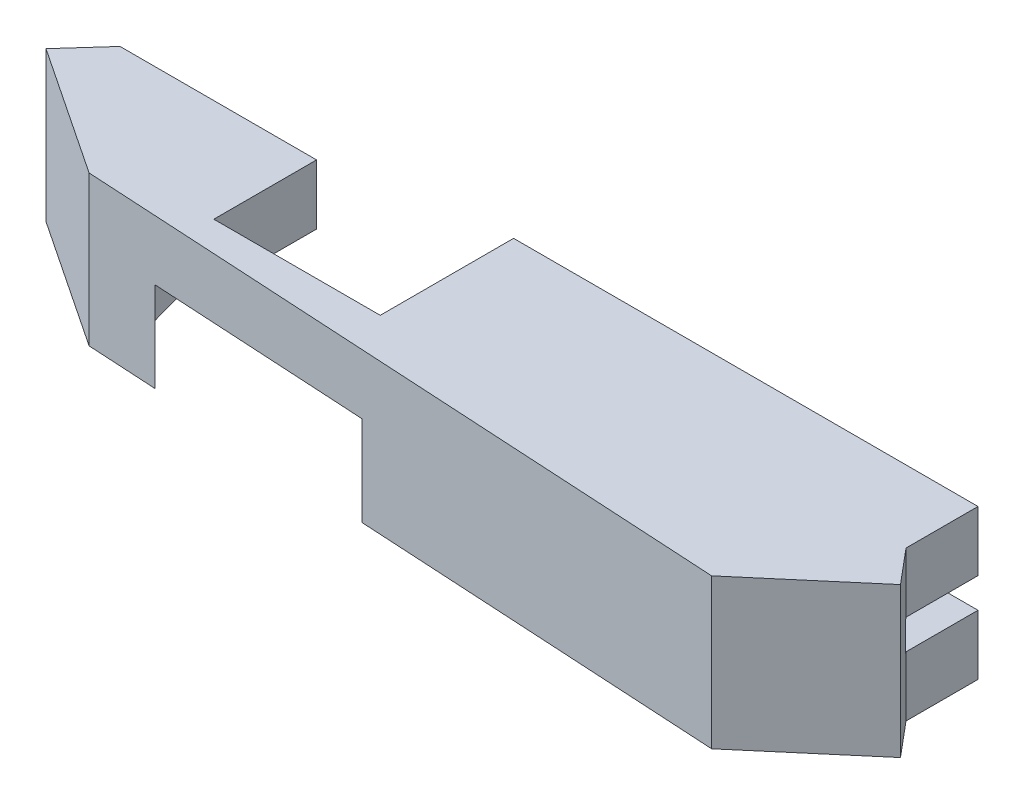
ISO-10303-21;
HEADER;
FILE_DESCRIPTION(('STEP AP214'),'2;1');
FILE_NAME('part.step','',(''),(''),'','','');
FILE_SCHEMA(('AUTOMOTIVE_DESIGN { 1 0 10303 214 1 1 1 1 }'));
ENDSEC;
DATA;
#1=APPLICATION_CONTEXT('core data for automotive mechanical design processes');
#2=APPLICATION_PROTOCOL_DEFINITION('international standard','automotive_design',2000,#1);
#3=PRODUCT_CONTEXT('',#1,'mechanical');
#4=PRODUCT('Part','Part','',(#3));
#5=PRODUCT_RELATED_PRODUCT_CATEGORY('part','',(#4));
#6=PRODUCT_DEFINITION_FORMATION('','',#4);
#7=PRODUCT_DEFINITION_CONTEXT('part definition',#1,'design');
#8=PRODUCT_DEFINITION('design','',#6,#7);
#9=PRODUCT_DEFINITION_SHAPE('','',#8);
#10=(LENGTH_UNIT() NAMED_UNIT(*) SI_UNIT(.MILLI.,.METRE.));
#11=(NAMED_UNIT(*) PLANE_ANGLE_UNIT() SI_UNIT($,.RADIAN.));
#12=(NAMED_UNIT(*) SI_UNIT($,.STERADIAN.) SOLID_ANGLE_UNIT());
#13=UNCERTAINTY_MEASURE_WITH_UNIT(LENGTH_MEASURE(1.E-05),#10,'distance_accuracy_value','');
#14=(GEOMETRIC_REPRESENTATION_CONTEXT(3) GLOBAL_UNCERTAINTY_ASSIGNED_CONTEXT((#13)) GLOBAL_UNIT_ASSIGNED_CONTEXT((#10,
#11,#12)) REPRESENTATION_CONTEXT('',''));
#15=CARTESIAN_POINT('',(0.,0.,0.));
#16=DIRECTION('',(0.,0.,1.));
#17=DIRECTION('',(1.,0.,0.));
#18=AXIS2_PLACEMENT_3D('',#15,#16,#17);
#19=CARTESIAN_POINT('',(0.,-6.,0.));
#20=DIRECTION('',(0.,-1.,0.));
#21=DIRECTION('',(0.,0.,-1.));
#22=AXIS2_PLACEMENT_3D('',#19,#20,#21);
#23=PLANE('',#22);
#24=DIRECTION('',(-0.831488262823537,0.,-0.555542319528131));
#25=VECTOR('',#24,1.);
#26=CARTESIAN_POINT('',(0.212763339109905,-6.,-0.318445981539796));
#27=LINE('',#26,#25);
#28=CARTESIAN_POINT('',(3.31085332593218,-6.,1.75148112908664));
#29=VERTEX_POINT('',#28);
#30=CARTESIAN_POINT('',(0.689386067363199,-6.,0.));
#31=VERTEX_POINT('',#30);
#32=EDGE_CURVE('E269',#29,#31,#27,.T.);
#33=ORIENTED_EDGE('',*,*,#32,.F.);
#34=DIRECTION('',(0.998377105019339,0.,0.0569487152901927));
#35=VECTOR('',#34,1.);
#36=CARTESIAN_POINT('',(-0.0888451107429899,-6.,1.55755795379609));
#37=LINE('',#36,#35);
#38=CARTESIAN_POINT('',(-1.3382612127177,-6.,1.48628965095479));
#39=VERTEX_POINT('',#38);
#40=EDGE_CURVE('E300',#39,#29,#37,.T.);
#41=ORIENTED_EDGE('',*,*,#40,.F.);
#42=DIRECTION('',(0.832202433014696,0.,0.554471920375073));
#43=VECTOR('',#42,1.);
#44=CARTESIAN_POINT('',(-1.09725675273359,-6.,1.64686380989142));
#45=LINE('',#44,#43);
#46=CARTESIAN_POINT('',(-9.95919158339931,-6.,-4.25758182600735));
#47=VERTEX_POINT('',#46);
#48=EDGE_CURVE('E304',#47,#39,#45,.T.);
#49=ORIENTED_EDGE('',*,*,#48,.F.);
#50=DIRECTION('',(-0.669130606358839,0.,0.743144825477412));
#51=VECTOR('',#50,1.);
#52=CARTESIAN_POINT('',(-7.61723446114347,-6.,-6.8585887151781));
#53=LINE('',#52,#51);
#54=CARTESIAN_POINT('',(-7.61723446114333,-6.,-6.85858871517825));
#55=VERTEX_POINT('',#54);
#56=EDGE_CURVE('E308',#55,#47,#53,.T.);
#57=ORIENTED_EDGE('',*,*,#56,.F.);
#58=DIRECTION('',(-1.,0.,0.));
#59=VECTOR('',#58,1.);
#60=CARTESIAN_POINT('',(0.,-6.,-6.85858871517825));
#61=LINE('',#60,#59);
#62=CARTESIAN_POINT('',(-1.90430861528583,-6.,-6.85858871517825));
#63=VERTEX_POINT('',#62);
#64=EDGE_CURVE('E312',#63,#55,#61,.T.);
#65=ORIENTED_EDGE('',*,*,#64,.F.);
#66=DIRECTION('',(-0.26753236006603,0.,-0.963548875935985));
#67=VECTOR('',#66,1.);
#68=CARTESIAN_POINT('',(0.,-6.,0.));
#69=LINE('',#68,#67);
#70=CARTESIAN_POINT('',(0.,-6.,0.));
#71=VERTEX_POINT('',#70);
#72=EDGE_CURVE('E667',#71,#63,#69,.T.);
#73=ORIENTED_EDGE('',*,*,#72,.F.);
#74=DIRECTION('',(1.,0.,0.));
#75=VECTOR('',#74,1.);
#76=CARTESIAN_POINT('',(0.,-6.,0.));
#77=LINE('',#76,#75);
#78=EDGE_CURVE('E276',#71,#31,#77,.T.);
#79=ORIENTED_EDGE('',*,*,#78,.T.);
#80=EDGE_LOOP('',(#33,#41,#49,#57,#65,#73,#79));
#81=FACE_BOUND('',#80,.T.);
#82=ADVANCED_FACE('F44',(#81),#23,.T.);
#83=CARTESIAN_POINT('',(0.,-2.,0.));
#84=DIRECTION('',(0.,-1.,0.));
#85=DIRECTION('',(0.,0.,-1.));
#86=AXIS2_PLACEMENT_3D('',#83,#84,#85);
#87=PLANE('',#86);
#88=DIRECTION('',(1.,0.,0.));
#89=VECTOR('',#88,1.);
#90=CARTESIAN_POINT('',(0.,-2.,0.3));
#91=LINE('',#90,#89);
#92=CARTESIAN_POINT('',(-0.115159210510547,-2.,0.300000000000004));
#93=VERTEX_POINT('',#92);
#94=CARTESIAN_POINT('',(1.13840042698739,-2.,0.3));
#95=VERTEX_POINT('',#94);
#96=EDGE_CURVE('E364',#93,#95,#91,.T.);
#97=ORIENTED_EDGE('',*,*,#96,.T.);
#98=DIRECTION('',(-0.831488262823538,0.,-0.555542319528131));
#99=VECTOR('',#98,1.);
#100=CARTESIAN_POINT('',(0.212763339109905,-2.,-0.318445981539796));
#101=LINE('',#100,#99);
#102=CARTESIAN_POINT('',(0.689386067363199,-2.,0.));
#103=VERTEX_POINT('',#102);
#104=EDGE_CURVE('E657',#95,#103,#101,.T.);
#105=ORIENTED_EDGE('',*,*,#104,.T.);
#106=DIRECTION('',(1.,0.,0.));
#107=VECTOR('',#106,1.);
#108=CARTESIAN_POINT('',(0.,-2.,0.));
#109=LINE('',#108,#107);
#110=CARTESIAN_POINT('',(0.,-2.,0.));
#111=VERTEX_POINT('',#110);
#112=EDGE_CURVE('E316',#111,#103,#109,.T.);
#113=ORIENTED_EDGE('',*,*,#112,.F.);
#114=DIRECTION('',(-0.26753236006603,0.,-0.963548875935985));
#115=VECTOR('',#114,1.);
#116=CARTESIAN_POINT('',(0.,-2.,0.));
#117=LINE('',#116,#115);
#118=CARTESIAN_POINT('',(-1.90430861528583,-2.,-6.85858871517825));
#119=VERTEX_POINT('',#118);
#120=EDGE_CURVE('E533',#111,#119,#117,.T.);
#121=ORIENTED_EDGE('',*,*,#120,.T.);
#122=DIRECTION('',(-1.,0.,0.));
#123=VECTOR('',#122,1.);
#124=CARTESIAN_POINT('',(0.,-2.,-6.85858871517825));
#125=LINE('',#124,#123);
#126=CARTESIAN_POINT('',(-7.61723446114333,-2.,-6.85858871517825));
#127=VERTEX_POINT('',#126);
#128=EDGE_CURVE('E277',#119,#127,#125,.T.);
#129=ORIENTED_EDGE('',*,*,#128,.T.);
#130=DIRECTION('',(-0.669130606358839,0.,0.743144825477412));
#131=VECTOR('',#130,1.);
#132=CARTESIAN_POINT('',(-7.61723446114347,-2.,-6.8585887151781));
#133=LINE('',#132,#131);
#134=CARTESIAN_POINT('',(-7.81797364305098,-2.,-6.63564526753503));
#135=VERTEX_POINT('',#134);
#136=EDGE_CURVE('E283',#127,#135,#133,.T.);
#137=ORIENTED_EDGE('',*,*,#136,.T.);
#138=DIRECTION('',(0.743144825477401,0.,0.66913060635885));
#139=VECTOR('',#138,1.);
#140=CARTESIAN_POINT('',(-0.200739181907623,-2.,0.222943447643185));
#141=LINE('',#140,#139);
#142=EDGE_CURVE('E368',#135,#93,#141,.T.);
#143=ORIENTED_EDGE('',*,*,#142,.T.);
#144=EDGE_LOOP('',(#97,#105,#113,#121,#129,#137,#143));
#145=FACE_BOUND('',#144,.T.);
#146=ADVANCED_FACE('F680',(#145),#87,.F.);
#147=CARTESIAN_POINT('',(0.,-2.,0.3));
#148=DIRECTION('',(0.,0.,1.));
#149=DIRECTION('',(1.,0.,0.));
#150=AXIS2_PLACEMENT_3D('',#147,#148,#149);
#151=PLANE('',#150);
#152=DIRECTION('',(1.,0.,0.));
#153=VECTOR('',#152,1.);
#154=CARTESIAN_POINT('',(0.,0.,0.3));
#155=LINE('',#154,#153);
#156=CARTESIAN_POINT('',(-0.115159210510547,0.,0.300000000000004));
#157=VERTEX_POINT('',#156);
#158=CARTESIAN_POINT('',(1.13840042698739,0.,0.3));
#159=VERTEX_POINT('',#158);
#160=EDGE_CURVE('E386',#157,#159,#155,.T.);
#161=ORIENTED_EDGE('',*,*,#160,.T.);
#162=DIRECTION('',(0.,-1.,0.));
#163=VECTOR('',#162,1.);
#164=CARTESIAN_POINT('',(1.13840042698739,-2.,0.3));
#165=LINE('',#164,#163);
#166=EDGE_CURVE('E653',#159,#95,#165,.T.);
#167=ORIENTED_EDGE('',*,*,#166,.T.);
#168=ORIENTED_EDGE('',*,*,#96,.F.);
#169=DIRECTION('',(0.,1.,0.));
#170=VECTOR('',#169,1.);
#171=CARTESIAN_POINT('',(-0.115159210510547,-2.,0.300000000000004));
#172=LINE('',#171,#170);
#173=EDGE_CURVE('E414',#93,#157,#172,.T.);
#174=ORIENTED_EDGE('',*,*,#173,.T.);
#175=EDGE_LOOP('',(#161,#167,#168,#174));
#176=FACE_BOUND('',#175,.T.);
#177=ADVANCED_FACE('F685',(#176),#151,.F.);
#178=CARTESIAN_POINT('',(0.,-6.,0.));
#179=DIRECTION('',(0.,0.,1.));
#180=DIRECTION('',(1.,0.,0.));
#181=AXIS2_PLACEMENT_3D('',#178,#179,#180);
#182=PLANE('',#181);
#183=ORIENTED_EDGE('',*,*,#112,.T.);
#184=DIRECTION('',(0.,-1.,0.));
#185=VECTOR('',#184,1.);
#186=CARTESIAN_POINT('',(0.689386067363195,-6.,0.));
#187=LINE('',#186,#185);
#188=EDGE_CURVE('E11',#103,#31,#187,.T.);
#189=ORIENTED_EDGE('',*,*,#188,.T.);
#190=ORIENTED_EDGE('',*,*,#78,.F.);
#191=DIRECTION('',(0.,1.,0.));
#192=VECTOR('',#191,1.);
#193=CARTESIAN_POINT('',(0.,-6.,0.));
#194=LINE('',#193,#192);
#195=EDGE_CURVE('E315',#71,#111,#194,.T.);
#196=ORIENTED_EDGE('',*,*,#195,.T.);
#197=EDGE_LOOP('',(#183,#189,#190,#196));
#198=FACE_BOUND('',#197,.T.);
#199=ADVANCED_FACE('F676',(#198),#182,.F.);
#200=CARTESIAN_POINT('',(0.,-6.,-8.9));
#201=DIRECTION('',(0.,0.,1.));
#202=DIRECTION('',(1.,0.,0.));
#203=AXIS2_PLACEMENT_3D('',#200,#201,#202);
#204=PLANE('',#203);
#205=DIRECTION('',(0.,-1.,0.));
#206=VECTOR('',#205,1.);
#207=CARTESIAN_POINT('',(25.6590036881544,0.,-8.9));
#208=LINE('',#207,#206);
#209=CARTESIAN_POINT('',(25.6590036881544,-2.,-8.9));
#210=VERTEX_POINT('',#209);
#211=CARTESIAN_POINT('',(25.6590036881544,-6.,-8.9));
#212=VERTEX_POINT('',#211);
#213=EDGE_CURVE('E541',#210,#212,#208,.T.);
#214=ORIENTED_EDGE('',*,*,#213,.F.);
#215=DIRECTION('',(1.,0.,0.));
#216=VECTOR('',#215,1.);
#217=CARTESIAN_POINT('',(0.,-2.,-8.9));
#218=LINE('',#217,#216);
#219=CARTESIAN_POINT('',(47.61,-2.,-8.9));
#220=VERTEX_POINT('',#219);
#221=EDGE_CURVE('E320',#210,#220,#218,.T.);
#222=ORIENTED_EDGE('',*,*,#221,.T.);
#223=DIRECTION('',(0.,1.,0.));
#224=VECTOR('',#223,1.);
#225=CARTESIAN_POINT('',(47.61,-6.,-8.9));
#226=LINE('',#225,#224);
#227=CARTESIAN_POINT('',(47.61,-6.,-8.9));
#228=VERTEX_POINT('',#227);
#229=EDGE_CURVE('E344',#228,#220,#226,.T.);
#230=ORIENTED_EDGE('',*,*,#229,.F.);
#231=DIRECTION('',(1.,0.,0.));
#232=VECTOR('',#231,1.);
#233=CARTESIAN_POINT('',(0.,-6.,-8.9));
#234=LINE('',#233,#232);
#235=EDGE_CURVE('E282',#212,#228,#234,.T.);
#236=ORIENTED_EDGE('',*,*,#235,.F.);
#237=EDGE_LOOP('',(#214,#222,#230,#236));
#238=FACE_BOUND('',#237,.T.);
#239=ADVANCED_FACE('F546',(#238),#204,.F.);
#240=DIRECTION('',(-0.908348368176786,0.,0.418214349383866));
#241=VECTOR('',#240,1.);
#242=CARTESIAN_POINT('',(4.12613507818719,-6.,8.96183517057705));
#243=LINE('',#242,#241);
#244=CARTESIAN_POINT('',(23.5909582365889,-6.,0.));
#245=VERTEX_POINT('',#244);
#246=CARTESIAN_POINT('',(17.970575963511,-6.,2.58769057992786));
#247=VERTEX_POINT('',#246);
#248=EDGE_CURVE('E253',#245,#247,#243,.T.);
#249=ORIENTED_EDGE('',*,*,#248,.F.);
#250=CARTESIAN_POINT('',(24.1511840902221,-6.,0.));
#251=VERTEX_POINT('',#250);
#252=EDGE_CURVE('E264',#245,#251,#77,.T.);
#253=ORIENTED_EDGE('',*,*,#252,.T.);
#254=DIRECTION('',(0.167037696778537,0.,-0.985950509840591));
#255=VECTOR('',#254,1.);
#256=CARTESIAN_POINT('',(23.477327601916,-6.,3.9774802994658));
#257=LINE('',#256,#255);
#258=EDGE_CURVE('E549',#251,#212,#257,.T.);
#259=ORIENTED_EDGE('',*,*,#258,.T.);
#260=ORIENTED_EDGE('',*,*,#235,.T.);
#261=DIRECTION('',(0.,0.,1.));
#262=VECTOR('',#261,1.);
#263=CARTESIAN_POINT('',(47.61,-6.,0.));
#264=LINE('',#263,#262);
#265=CARTESIAN_POINT('',(47.61,-6.,-4.09480620014514));
#266=VERTEX_POINT('',#265);
#267=EDGE_CURVE('E290',#228,#266,#264,.T.);
#268=ORIENTED_EDGE('',*,*,#267,.T.);
#269=DIRECTION('',(0.642787609686537,0.,0.76604444311898));
#270=VECTOR('',#269,1.);
#271=CARTESIAN_POINT('',(29.9549933158541,-6.,-25.1352238432509));
#272=LINE('',#271,#270);
#273=CARTESIAN_POINT('',(49.5383628290596,-6.,-1.79667287078821));
#274=VERTEX_POINT('',#273);
#275=EDGE_CURVE('E293',#266,#274,#272,.T.);
#276=ORIENTED_EDGE('',*,*,#275,.T.);
#277=DIRECTION('',(-0.761411231132892,0.,0.648269185681915));
#278=VECTOR('',#277,1.);
#279=CARTESIAN_POINT('',(19.9318057575859,-6.,23.410492270462));
#280=LINE('',#279,#278);
#281=CARTESIAN_POINT('',(42.73,-6.,3.99999999999999));
#282=VERTEX_POINT('',#281);
#283=EDGE_CURVE('E297',#274,#282,#280,.T.);
#284=ORIENTED_EDGE('',*,*,#283,.T.);
#285=EDGE_CURVE('E267',#247,#282,#37,.T.);
#286=ORIENTED_EDGE('',*,*,#285,.F.);
#287=EDGE_LOOP('',(#249,#253,#259,#260,#268,#276,#284,#286));
#288=FACE_BOUND('',#287,.T.);
#289=ADVANCED_FACE('F262',(#288),#23,.T.);
#290=CARTESIAN_POINT('',(23.5909582365889,-2.,0.));
#291=VERTEX_POINT('',#290);
#292=CARTESIAN_POINT('',(24.1511840902221,-2.,0.));
#293=VERTEX_POINT('',#292);
#294=EDGE_CURVE('E321',#291,#293,#109,.T.);
#295=ORIENTED_EDGE('',*,*,#294,.F.);
#296=DIRECTION('',(-0.908348368176786,0.,0.418214349383866));
#297=VECTOR('',#296,1.);
#298=CARTESIAN_POINT('',(4.12613507818719,-2.,8.96183517057705));
#299=LINE('',#298,#297);
#300=CARTESIAN_POINT('',(22.9393677044742,-2.,0.3));
#301=VERTEX_POINT('',#300);
#302=EDGE_CURVE('E60',#291,#301,#299,.T.);
#303=ORIENTED_EDGE('',*,*,#302,.T.);
#304=CARTESIAN_POINT('',(24.3511840902221,-2.,0.300000000000001));
#305=VERTEX_POINT('',#304);
#306=EDGE_CURVE('E363',#301,#305,#91,.T.);
#307=ORIENTED_EDGE('',*,*,#306,.T.);
#308=DIRECTION('',(0.,0.,-1.));
#309=VECTOR('',#308,1.);
#310=CARTESIAN_POINT('',(24.3511840902221,-2.,0.));
#311=LINE('',#310,#309);
#312=CARTESIAN_POINT('',(24.3511840902221,-2.,-0.607570660968924));
#313=VERTEX_POINT('',#312);
#314=EDGE_CURVE('E360',#305,#313,#311,.T.);
#315=ORIENTED_EDGE('',*,*,#314,.T.);
#316=CARTESIAN_POINT('',(29.26,-2.,0.95));
#317=DIRECTION('',(0.,1.,0.));
#318=DIRECTION('',(0.,0.,1.));
#319=AXIS2_PLACEMENT_3D('',#316,#317,#318);
#320=CIRCLE('',#319,5.15);
#321=CARTESIAN_POINT('',(34.1688159097779,-2.,-0.607570660968913));
#322=VERTEX_POINT('',#321);
#323=EDGE_CURVE('E355',#322,#313,#320,.T.);
#324=ORIENTED_EDGE('',*,*,#323,.F.);
#325=DIRECTION('',(0.,0.,-1.));
#326=VECTOR('',#325,1.);
#327=CARTESIAN_POINT('',(34.1688159097779,-2.,0.));
#328=LINE('',#327,#326);
#329=CARTESIAN_POINT('',(34.1688159097779,-2.,0.3));
#330=VERTEX_POINT('',#329);
#331=EDGE_CURVE('E351',#330,#322,#328,.T.);
#332=ORIENTED_EDGE('',*,*,#331,.F.);
#333=CARTESIAN_POINT('',(42.8391910702798,-2.,0.299999999999998));
#334=VERTEX_POINT('',#333);
#335=EDGE_CURVE('E369',#330,#334,#91,.T.);
#336=ORIENTED_EDGE('',*,*,#335,.T.);
#337=DIRECTION('',(-0.766044443118979,0.,0.642787609686538));
#338=VECTOR('',#337,1.);
#339=CARTESIAN_POINT('',(17.8478429670519,-2.,21.2702309760415));
#340=LINE('',#339,#338);
#341=CARTESIAN_POINT('',(47.802836282906,-2.,-3.86499286720945));
#342=VERTEX_POINT('',#341);
#343=EDGE_CURVE('E372',#342,#334,#340,.T.);
#344=ORIENTED_EDGE('',*,*,#343,.F.);
#345=DIRECTION('',(0.642787609686537,0.,0.76604444311898));
#346=VECTOR('',#345,1.);
#347=CARTESIAN_POINT('',(29.9549933158541,-2.,-25.1352238432509));
#348=LINE('',#347,#346);
#349=CARTESIAN_POINT('',(47.61,-2.,-4.09480620014514));
#350=VERTEX_POINT('',#349);
#351=EDGE_CURVE('E327',#350,#342,#348,.T.);
#352=ORIENTED_EDGE('',*,*,#351,.F.);
#353=DIRECTION('',(0.,0.,1.));
#354=VECTOR('',#353,1.);
#355=CARTESIAN_POINT('',(47.61,-2.,0.));
#356=LINE('',#355,#354);
#357=EDGE_CURVE('E324',#220,#350,#356,.T.);
#358=ORIENTED_EDGE('',*,*,#357,.F.);
#359=ORIENTED_EDGE('',*,*,#221,.F.);
#360=DIRECTION('',(0.167037696778537,0.,-0.985950509840591));
#361=VECTOR('',#360,1.);
#362=CARTESIAN_POINT('',(23.477327601916,-2.,3.9774802994658));
#363=LINE('',#362,#361);
#364=EDGE_CURVE('E259',#293,#210,#363,.T.);
#365=ORIENTED_EDGE('',*,*,#364,.F.);
#366=EDGE_LOOP('',(#295,#303,#307,#315,#324,#332,#336,#344,#352,#358,#359,#365));
#367=FACE_BOUND('',#366,.T.);
#368=ADVANCED_FACE('F552',(#367),#87,.F.);
#369=CARTESIAN_POINT('',(0.,0.,0.));
#370=DIRECTION('',(0.,1.,0.));
#371=DIRECTION('',(0.,0.,1.));
#372=AXIS2_PLACEMENT_3D('',#369,#370,#371);
#373=PLANE('',#372);
#374=DIRECTION('',(0.,0.,-1.));
#375=VECTOR('',#374,1.);
#376=CARTESIAN_POINT('',(5.5,0.,0.));
#377=LINE('',#376,#375);
#378=CARTESIAN_POINT('',(5.5,0.,0.));
#379=VERTEX_POINT('',#378);
#380=CARTESIAN_POINT('',(5.5,0.,-6.85858871517826));
#381=VERTEX_POINT('',#380);
#382=EDGE_CURVE('E435',#379,#381,#377,.T.);
#383=ORIENTED_EDGE('',*,*,#382,.F.);
#384=DIRECTION('',(1.,0.,0.));
#385=VECTOR('',#384,1.);
#386=CARTESIAN_POINT('',(0.,0.,0.));
#387=LINE('',#386,#385);
#388=CARTESIAN_POINT('',(16.61,0.,0.));
#389=VERTEX_POINT('',#388);
#390=EDGE_CURVE('E491',#379,#389,#387,.T.);
#391=ORIENTED_EDGE('',*,*,#390,.T.);
#392=DIRECTION('',(0.,0.,-1.));
#393=VECTOR('',#392,1.);
#394=CARTESIAN_POINT('',(16.61,0.,0.));
#395=LINE('',#394,#393);
#396=CARTESIAN_POINT('',(16.61,0.,-8.9));
#397=VERTEX_POINT('',#396);
#398=EDGE_CURVE('E487',#389,#397,#395,.T.);
#399=ORIENTED_EDGE('',*,*,#398,.T.);
#400=DIRECTION('',(1.,0.,0.));
#401=VECTOR('',#400,1.);
#402=CARTESIAN_POINT('',(0.,0.,-8.9));
#403=LINE('',#402,#401);
#404=CARTESIAN_POINT('',(47.61,0.,-8.9));
#405=VERTEX_POINT('',#404);
#406=EDGE_CURVE('E484',#397,#405,#403,.T.);
#407=ORIENTED_EDGE('',*,*,#406,.T.);
#408=DIRECTION('',(0.,0.,1.));
#409=VECTOR('',#408,1.);
#410=CARTESIAN_POINT('',(47.61,0.,0.));
#411=LINE('',#410,#409);
#412=CARTESIAN_POINT('',(47.61,0.,-4.09480620014514));
#413=VERTEX_POINT('',#412);
#414=EDGE_CURVE('E480',#405,#413,#411,.T.);
#415=ORIENTED_EDGE('',*,*,#414,.T.);
#416=DIRECTION('',(0.642787609686538,0.,0.766044443118979));
#417=VECTOR('',#416,1.);
#418=CARTESIAN_POINT('',(29.954993315854,0.,-25.1352238432509));
#419=LINE('',#418,#417);
#420=CARTESIAN_POINT('',(47.802836282906,0.,-3.86499286720944));
#421=VERTEX_POINT('',#420);
#422=EDGE_CURVE('E477',#413,#421,#419,.T.);
#423=ORIENTED_EDGE('',*,*,#422,.T.);
#424=DIRECTION('',(-0.766044443118979,0.,0.642787609686538));
#425=VECTOR('',#424,1.);
#426=CARTESIAN_POINT('',(17.8478429670519,0.,21.2702309760415));
#427=LINE('',#426,#425);
#428=CARTESIAN_POINT('',(42.8391910702798,0.,0.299999999999998));
#429=VERTEX_POINT('',#428);
#430=EDGE_CURVE('E394',#421,#429,#427,.T.);
#431=ORIENTED_EDGE('',*,*,#430,.T.);
#432=CARTESIAN_POINT('',(34.1688159097779,0.,0.3));
#433=VERTEX_POINT('',#432);
#434=EDGE_CURVE('E356',#433,#429,#155,.T.);
#435=ORIENTED_EDGE('',*,*,#434,.F.);
#436=DIRECTION('',(0.,0.,-1.));
#437=VECTOR('',#436,1.);
#438=CARTESIAN_POINT('',(34.1688159097779,0.,0.));
#439=LINE('',#438,#437);
#440=CARTESIAN_POINT('',(34.1688159097779,0.,-0.607570660968913));
#441=VERTEX_POINT('',#440);
#442=EDGE_CURVE('E350',#433,#441,#439,.T.);
#443=ORIENTED_EDGE('',*,*,#442,.T.);
#444=CARTESIAN_POINT('',(29.26,0.,0.95));
#445=DIRECTION('',(0.,1.,0.));
#446=DIRECTION('',(0.,0.,1.));
#447=AXIS2_PLACEMENT_3D('',#444,#445,#446);
#448=CIRCLE('',#447,5.15);
#449=CARTESIAN_POINT('',(24.3511840902221,0.,-0.607570660968924));
#450=VERTEX_POINT('',#449);
#451=EDGE_CURVE('E378',#441,#450,#448,.T.);
#452=ORIENTED_EDGE('',*,*,#451,.T.);
#453=DIRECTION('',(0.,0.,-1.));
#454=VECTOR('',#453,1.);
#455=CARTESIAN_POINT('',(24.3511840902221,0.,0.));
#456=LINE('',#455,#454);
#457=CARTESIAN_POINT('',(24.3511840902221,0.,0.300000000000001));
#458=VERTEX_POINT('',#457);
#459=EDGE_CURVE('E381',#458,#450,#456,.T.);
#460=ORIENTED_EDGE('',*,*,#459,.F.);
#461=CARTESIAN_POINT('',(22.9393677044742,0.,0.3));
#462=VERTEX_POINT('',#461);
#463=EDGE_CURVE('E385',#462,#458,#155,.T.);
#464=ORIENTED_EDGE('',*,*,#463,.F.);
#465=DIRECTION('',(-0.908348368176786,0.,0.418214349383866));
#466=VECTOR('',#465,1.);
#467=CARTESIAN_POINT('',(4.12613507818719,0.,8.96183517057705));
#468=LINE('',#467,#466);
#469=CARTESIAN_POINT('',(17.970575963511,0.,2.58769057992786));
#470=VERTEX_POINT('',#469);
#471=EDGE_CURVE('E637',#462,#470,#468,.T.);
#472=ORIENTED_EDGE('',*,*,#471,.T.);
#473=DIRECTION('',(-0.998377105019339,0.,-0.0569487152901926));
#474=VECTOR('',#473,1.);
#475=CARTESIAN_POINT('',(-0.0888451107429903,0.,1.5575579537961));
#476=LINE('',#475,#474);
#477=CARTESIAN_POINT('',(3.31085332593218,0.,1.75148112908664));
#478=VERTEX_POINT('',#477);
#479=EDGE_CURVE('E664',#470,#478,#476,.T.);
#480=ORIENTED_EDGE('',*,*,#479,.T.);
#481=DIRECTION('',(-0.831488262823537,0.,-0.555542319528131));
#482=VECTOR('',#481,1.);
#483=CARTESIAN_POINT('',(0.212763339109905,0.,-0.318445981539796));
#484=LINE('',#483,#482);
#485=EDGE_CURVE('E641',#478,#159,#484,.T.);
#486=ORIENTED_EDGE('',*,*,#485,.T.);
#487=ORIENTED_EDGE('',*,*,#160,.F.);
#488=DIRECTION('',(0.743144825477401,0.,0.66913060635885));
#489=VECTOR('',#488,1.);
#490=CARTESIAN_POINT('',(-0.200739181907623,0.,0.222943447643185));
#491=LINE('',#490,#489);
#492=CARTESIAN_POINT('',(-7.81797364305099,0.,-6.63564526753503));
#493=VERTEX_POINT('',#492);
#494=EDGE_CURVE('E390',#493,#157,#491,.T.);
#495=ORIENTED_EDGE('',*,*,#494,.F.);
#496=DIRECTION('',(-0.669130606358851,0.,0.743144825477401));
#497=VECTOR('',#496,1.);
#498=CARTESIAN_POINT('',(-7.61723446114336,0.,-6.85858871517823));
#499=LINE('',#498,#497);
#500=CARTESIAN_POINT('',(-7.61723446114333,0.,-6.85858871517826));
#501=VERTEX_POINT('',#500);
#502=EDGE_CURVE('E473',#501,#493,#499,.T.);
#503=ORIENTED_EDGE('',*,*,#502,.F.);
#504=DIRECTION('',(1.,0.,0.));
#505=VECTOR('',#504,1.);
#506=CARTESIAN_POINT('',(0.,0.,-6.85858871517826));
#507=LINE('',#506,#505);
#508=EDGE_CURVE('E401',#501,#381,#507,.T.);
#509=ORIENTED_EDGE('',*,*,#508,.T.);
#510=EDGE_LOOP('',(#383,#391,#399,#407,#415,#423,#431,#435,#443,#452,#460,#464,#472,#480,#486,
#487,#495,#503,#509));
#511=FACE_BOUND('',#510,.T.);
#512=ADVANCED_FACE('F592',(#511),#373,.F.);
#513=CARTESIAN_POINT('',(0.,4.,-6.85858871517826));
#514=DIRECTION('',(0.,0.,-1.));
#515=DIRECTION('',(-1.,0.,0.));
#516=AXIS2_PLACEMENT_3D('',#513,#514,#515);
#517=PLANE('',#516);
#518=ORIENTED_EDGE('',*,*,#508,.F.);
#519=DIRECTION('',(0.,-1.,0.));
#520=VECTOR('',#519,1.);
#521=CARTESIAN_POINT('',(-7.61723446114333,4.,-6.85858871517826));
#522=LINE('',#521,#520);
#523=CARTESIAN_POINT('',(-7.61723446114333,4.,-6.85858871517826));
#524=VERTEX_POINT('',#523);
#525=EDGE_CURVE('E530',#524,#501,#522,.T.);
#526=ORIENTED_EDGE('',*,*,#525,.F.);
#527=DIRECTION('',(1.,0.,0.));
#528=VECTOR('',#527,1.);
#529=CARTESIAN_POINT('',(0.,4.,-6.85858871517826));
#530=LINE('',#529,#528);
#531=CARTESIAN_POINT('',(5.5,4.,-6.85858871517826));
#532=VERTEX_POINT('',#531);
#533=EDGE_CURVE('E430',#524,#532,#530,.T.);
#534=ORIENTED_EDGE('',*,*,#533,.T.);
#535=DIRECTION('',(0.,-1.,0.));
#536=VECTOR('',#535,1.);
#537=CARTESIAN_POINT('',(5.5,4.,-6.85858871517826));
#538=LINE('',#537,#536);
#539=EDGE_CURVE('E470',#532,#381,#538,.T.);
#540=ORIENTED_EDGE('',*,*,#539,.T.);
#541=EDGE_LOOP('',(#518,#526,#534,#540));
#542=FACE_BOUND('',#541,.T.);
#543=ADVANCED_FACE('F46',(#542),#517,.T.);
#544=CARTESIAN_POINT('',(-7.61723446114336,4.,-6.85858871517823));
#545=DIRECTION('',(0.743144825477401,0.,0.669130606358851));
#546=DIRECTION('',(0.669130606358851,0.,-0.743144825477401));
#547=AXIS2_PLACEMENT_3D('',#544,#545,#546);
#548=PLANE('',#547);
#549=ORIENTED_EDGE('',*,*,#502,.T.);
#550=DIRECTION('',(0.,1.,0.));
#551=VECTOR('',#550,1.);
#552=CARTESIAN_POINT('',(-7.81797364305099,-2.,-6.63564526753503));
#553=LINE('',#552,#551);
#554=EDGE_CURVE('E410',#135,#493,#553,.T.);
#555=ORIENTED_EDGE('',*,*,#554,.F.);
#556=ORIENTED_EDGE('',*,*,#136,.F.);
#557=DIRECTION('',(0.,1.,0.));
#558=VECTOR('',#557,1.);
#559=CARTESIAN_POINT('',(-7.61723446114333,-6.,-6.85858871517825));
#560=LINE('',#559,#558);
#561=EDGE_CURVE('E336',#55,#127,#560,.T.);
#562=ORIENTED_EDGE('',*,*,#561,.F.);
#563=ORIENTED_EDGE('',*,*,#56,.T.);
#564=DIRECTION('',(0.,-1.,0.));
#565=VECTOR('',#564,1.);
#566=CARTESIAN_POINT('',(-9.95919158339931,4.,-4.25758182600735));
#567=LINE('',#566,#565);
#568=CARTESIAN_POINT('',(-9.95919158339931,4.,-4.25758182600735));
#569=VERTEX_POINT('',#568);
#570=EDGE_CURVE('E527',#569,#47,#567,.T.);
#571=ORIENTED_EDGE('',*,*,#570,.F.);
#572=DIRECTION('',(-0.669130606358851,0.,0.743144825477401));
#573=VECTOR('',#572,1.);
#574=CARTESIAN_POINT('',(-7.61723446114336,4.,-6.85858871517823));
#575=LINE('',#574,#573);
#576=EDGE_CURVE('E434',#524,#569,#575,.T.);
#577=ORIENTED_EDGE('',*,*,#576,.F.);
#578=ORIENTED_EDGE('',*,*,#525,.T.);
#579=EDGE_LOOP('',(#549,#555,#556,#562,#563,#571,#577,#578));
#580=FACE_BOUND('',#579,.T.);
#581=ADVANCED_FACE('F621',(#580),#548,.F.);
#582=CARTESIAN_POINT('',(-1.0972567527336,4.,1.64686380989142));
#583=DIRECTION('',(0.554471920375073,0.,-0.832202433014696));
#584=DIRECTION('',(-0.832202433014696,0.,-0.554471920375073));
#585=AXIS2_PLACEMENT_3D('',#582,#583,#584);
#586=PLANE('',#585);
#587=ORIENTED_EDGE('',*,*,#570,.T.);
#588=ORIENTED_EDGE('',*,*,#48,.T.);
#589=DIRECTION('',(0.,-1.,0.));
#590=VECTOR('',#589,1.);
#591=CARTESIAN_POINT('',(-1.3382612127177,4.,1.4862896509548));
#592=LINE('',#591,#590);
#593=CARTESIAN_POINT('',(-1.3382612127177,4.,1.4862896509548));
#594=VERTEX_POINT('',#593);
#595=EDGE_CURVE('E524',#594,#39,#592,.T.);
#596=ORIENTED_EDGE('',*,*,#595,.F.);
#597=DIRECTION('',(0.832202433014696,0.,0.554471920375073));
#598=VECTOR('',#597,1.);
#599=CARTESIAN_POINT('',(-1.0972567527336,4.,1.64686380989142));
#600=LINE('',#599,#598);
#601=EDGE_CURVE('E438',#569,#594,#600,.T.);
#602=ORIENTED_EDGE('',*,*,#601,.F.);
#603=EDGE_LOOP('',(#587,#588,#596,#602));
#604=FACE_BOUND('',#603,.T.);
#605=ADVANCED_FACE('F628',(#604),#586,.F.);
#606=CARTESIAN_POINT('',(-0.0888451107429903,4.,1.5575579537961));
#607=DIRECTION('',(0.0569487152901926,0.,-0.998377105019339));
#608=DIRECTION('',(-0.998377105019339,0.,-0.0569487152901926));
#609=AXIS2_PLACEMENT_3D('',#606,#607,#608);
#610=PLANE('',#609);
#611=ORIENTED_EDGE('',*,*,#40,.T.);
#612=DIRECTION('',(0.,1.,0.));
#613=VECTOR('',#612,1.);
#614=CARTESIAN_POINT('',(3.31085332593218,4.,1.75148112908664));
#615=LINE('',#614,#613);
#616=EDGE_CURVE('E661',#29,#478,#615,.T.);
#617=ORIENTED_EDGE('',*,*,#616,.T.);
#618=ORIENTED_EDGE('',*,*,#479,.F.);
#619=DIRECTION('',(0.,-1.,0.));
#620=VECTOR('',#619,1.);
#621=CARTESIAN_POINT('',(17.970575963511,4.,2.58769057992786));
#622=LINE('',#621,#620);
#623=EDGE_CURVE('E573',#470,#247,#622,.T.);
#624=ORIENTED_EDGE('',*,*,#623,.T.);
#625=ORIENTED_EDGE('',*,*,#285,.T.);
#626=DIRECTION('',(0.,-1.,0.));
#627=VECTOR('',#626,1.);
#628=CARTESIAN_POINT('',(42.73,4.,4.));
#629=LINE('',#628,#627);
#630=CARTESIAN_POINT('',(42.73,4.,4.));
#631=VERTEX_POINT('',#630);
#632=EDGE_CURVE('E520',#631,#282,#629,.T.);
#633=ORIENTED_EDGE('',*,*,#632,.F.);
#634=DIRECTION('',(0.998377105019339,0.,0.0569487152901926));
#635=VECTOR('',#634,1.);
#636=CARTESIAN_POINT('',(-0.0888451107429903,4.,1.5575579537961));
#637=LINE('',#636,#635);
#638=EDGE_CURVE('E441',#594,#631,#637,.T.);
#639=ORIENTED_EDGE('',*,*,#638,.F.);
#640=ORIENTED_EDGE('',*,*,#595,.T.);
#641=EDGE_LOOP('',(#611,#617,#618,#624,#625,#633,#639,#640));
#642=FACE_BOUND('',#641,.T.);
#643=ADVANCED_FACE('F571',(#642),#610,.F.);
#644=CARTESIAN_POINT('',(19.9318057575858,4.,23.4104922704619));
#645=DIRECTION('',(-0.648269185681914,0.,-0.761411231132894));
#646=DIRECTION('',(-0.761411231132894,0.,0.648269185681914));
#647=AXIS2_PLACEMENT_3D('',#644,#645,#646);
#648=PLANE('',#647);
#649=ORIENTED_EDGE('',*,*,#632,.T.);
#650=ORIENTED_EDGE('',*,*,#283,.F.);
#651=DIRECTION('',(0.,-1.,0.));
#652=VECTOR('',#651,1.);
#653=CARTESIAN_POINT('',(49.5383628290596,4.,-1.7966728707882));
#654=LINE('',#653,#652);
#655=CARTESIAN_POINT('',(49.5383628290596,4.,-1.7966728707882));
#656=VERTEX_POINT('',#655);
#657=EDGE_CURVE('E517',#656,#274,#654,.T.);
#658=ORIENTED_EDGE('',*,*,#657,.F.);
#659=DIRECTION('',(0.761411231132894,0.,-0.648269185681914));
#660=VECTOR('',#659,1.);
#661=CARTESIAN_POINT('',(19.9318057575858,4.,23.4104922704619));
#662=LINE('',#661,#660);
#663=EDGE_CURVE('E444',#631,#656,#662,.T.);
#664=ORIENTED_EDGE('',*,*,#663,.F.);
#665=EDGE_LOOP('',(#649,#650,#658,#664));
#666=FACE_BOUND('',#665,.T.);
#667=ADVANCED_FACE('F566',(#666),#648,.F.);
#668=CARTESIAN_POINT('',(29.954993315854,4.,-25.1352238432509));
#669=DIRECTION('',(0.766044443118979,0.,-0.642787609686538));
#670=DIRECTION('',(-0.642787609686538,0.,-0.766044443118979));
#671=AXIS2_PLACEMENT_3D('',#668,#669,#670);
#672=PLANE('',#671);
#673=ORIENTED_EDGE('',*,*,#422,.F.);
#674=DIRECTION('',(0.,-1.,0.));
#675=VECTOR('',#674,1.);
#676=CARTESIAN_POINT('',(47.61,4.,-4.09480620014514));
#677=LINE('',#676,#675);
#678=CARTESIAN_POINT('',(47.61,4.,-4.09480620014514));
#679=VERTEX_POINT('',#678);
#680=EDGE_CURVE('E514',#679,#413,#677,.T.);
#681=ORIENTED_EDGE('',*,*,#680,.F.);
#682=DIRECTION('',(0.642787609686538,0.,0.766044443118979));
#683=VECTOR('',#682,1.);
#684=CARTESIAN_POINT('',(29.954993315854,4.,-25.1352238432509));
#685=LINE('',#684,#683);
#686=EDGE_CURVE('E447',#679,#656,#685,.T.);
#687=ORIENTED_EDGE('',*,*,#686,.T.);
#688=ORIENTED_EDGE('',*,*,#657,.T.);
#689=ORIENTED_EDGE('',*,*,#275,.F.);
#690=DIRECTION('',(0.,1.,0.));
#691=VECTOR('',#690,1.);
#692=CARTESIAN_POINT('',(47.61,-6.,-4.09480620014514));
#693=LINE('',#692,#691);
#694=EDGE_CURVE('E340',#266,#350,#693,.T.);
#695=ORIENTED_EDGE('',*,*,#694,.T.);
#696=ORIENTED_EDGE('',*,*,#351,.T.);
#697=DIRECTION('',(0.,1.,0.));
#698=VECTOR('',#697,1.);
#699=CARTESIAN_POINT('',(47.802836282906,-2.,-3.86499286720944));
#700=LINE('',#699,#698);
#701=EDGE_CURVE('E406',#342,#421,#700,.T.);
#702=ORIENTED_EDGE('',*,*,#701,.T.);
#703=EDGE_LOOP('',(#673,#681,#687,#688,#689,#695,#696,#702));
#704=FACE_BOUND('',#703,.T.);
#705=ADVANCED_FACE('F561',(#704),#672,.T.);
#706=CARTESIAN_POINT('',(47.61,4.,0.));
#707=DIRECTION('',(1.,0.,0.));
#708=DIRECTION('',(0.,0.,-1.));
#709=AXIS2_PLACEMENT_3D('',#706,#707,#708);
#710=PLANE('',#709);
#711=ORIENTED_EDGE('',*,*,#414,.F.);
#712=DIRECTION('',(0.,-1.,0.));
#713=VECTOR('',#712,1.);
#714=CARTESIAN_POINT('',(47.61,4.,-8.9));
#715=LINE('',#714,#713);
#716=CARTESIAN_POINT('',(47.61,4.,-8.9));
#717=VERTEX_POINT('',#716);
#718=EDGE_CURVE('E510',#717,#405,#715,.T.);
#719=ORIENTED_EDGE('',*,*,#718,.F.);
#720=DIRECTION('',(0.,0.,1.));
#721=VECTOR('',#720,1.);
#722=CARTESIAN_POINT('',(47.61,4.,0.));
#723=LINE('',#722,#721);
#724=EDGE_CURVE('E451',#717,#679,#723,.T.);
#725=ORIENTED_EDGE('',*,*,#724,.T.);
#726=ORIENTED_EDGE('',*,*,#680,.T.);
#727=EDGE_LOOP('',(#711,#719,#725,#726));
#728=FACE_BOUND('',#727,.T.);
#729=ADVANCED_FACE('F595',(#728),#710,.T.);
#730=CARTESIAN_POINT('',(0.,4.,-8.9));
#731=DIRECTION('',(0.,0.,-1.));
#732=DIRECTION('',(-1.,0.,0.));
#733=AXIS2_PLACEMENT_3D('',#730,#731,#732);
#734=PLANE('',#733);
#735=ORIENTED_EDGE('',*,*,#406,.F.);
#736=DIRECTION('',(0.,-1.,0.));
#737=VECTOR('',#736,1.);
#738=CARTESIAN_POINT('',(16.61,4.,-8.9));
#739=LINE('',#738,#737);
#740=CARTESIAN_POINT('',(16.61,4.,-8.9));
#741=VERTEX_POINT('',#740);
#742=EDGE_CURVE('E507',#741,#397,#739,.T.);
#743=ORIENTED_EDGE('',*,*,#742,.F.);
#744=DIRECTION('',(1.,0.,0.));
#745=VECTOR('',#744,1.);
#746=CARTESIAN_POINT('',(0.,4.,-8.9));
#747=LINE('',#746,#745);
#748=EDGE_CURVE('E455',#741,#717,#747,.T.);
#749=ORIENTED_EDGE('',*,*,#748,.T.);
#750=ORIENTED_EDGE('',*,*,#718,.T.);
#751=EDGE_LOOP('',(#735,#743,#749,#750));
#752=FACE_BOUND('',#751,.T.);
#753=ADVANCED_FACE('F603',(#752),#734,.T.);
#754=CARTESIAN_POINT('',(16.61,4.,0.));
#755=DIRECTION('',(-1.,0.,0.));
#756=DIRECTION('',(0.,0.,1.));
#757=AXIS2_PLACEMENT_3D('',#754,#755,#756);
#758=PLANE('',#757);
#759=ORIENTED_EDGE('',*,*,#398,.F.);
#760=DIRECTION('',(0.,-1.,0.));
#761=VECTOR('',#760,1.);
#762=CARTESIAN_POINT('',(16.61,4.,0.));
#763=LINE('',#762,#761);
#764=CARTESIAN_POINT('',(16.61,4.,0.));
#765=VERTEX_POINT('',#764);
#766=EDGE_CURVE('E504',#765,#389,#763,.T.);
#767=ORIENTED_EDGE('',*,*,#766,.F.);
#768=DIRECTION('',(0.,0.,-1.));
#769=VECTOR('',#768,1.);
#770=CARTESIAN_POINT('',(16.61,4.,0.));
#771=LINE('',#770,#769);
#772=EDGE_CURVE('E459',#765,#741,#771,.T.);
#773=ORIENTED_EDGE('',*,*,#772,.T.);
#774=ORIENTED_EDGE('',*,*,#742,.T.);
#775=EDGE_LOOP('',(#759,#767,#773,#774));
#776=FACE_BOUND('',#775,.T.);
#777=ADVANCED_FACE('F606',(#776),#758,.T.);
#778=CARTESIAN_POINT('',(0.,4.,0.));
#779=DIRECTION('',(0.,0.,-1.));
#780=DIRECTION('',(-1.,0.,0.));
#781=AXIS2_PLACEMENT_3D('',#778,#779,#780);
#782=PLANE('',#781);
#783=ORIENTED_EDGE('',*,*,#390,.F.);
#784=DIRECTION('',(0.,-1.,0.));
#785=VECTOR('',#784,1.);
#786=CARTESIAN_POINT('',(5.5,4.,0.));
#787=LINE('',#786,#785);
#788=CARTESIAN_POINT('',(5.5,4.,0.));
#789=VERTEX_POINT('',#788);
#790=EDGE_CURVE('E501',#789,#379,#787,.T.);
#791=ORIENTED_EDGE('',*,*,#790,.F.);
#792=DIRECTION('',(1.,0.,0.));
#793=VECTOR('',#792,1.);
#794=CARTESIAN_POINT('',(0.,4.,0.));
#795=LINE('',#794,#793);
#796=EDGE_CURVE('E463',#789,#765,#795,.T.);
#797=ORIENTED_EDGE('',*,*,#796,.T.);
#798=ORIENTED_EDGE('',*,*,#766,.T.);
#799=EDGE_LOOP('',(#783,#791,#797,#798));
#800=FACE_BOUND('',#799,.T.);
#801=ADVANCED_FACE('F610',(#800),#782,.T.);
#802=CARTESIAN_POINT('',(5.5,4.,0.));
#803=DIRECTION('',(-1.,0.,0.));
#804=DIRECTION('',(0.,0.,1.));
#805=AXIS2_PLACEMENT_3D('',#802,#803,#804);
#806=PLANE('',#805);
#807=ORIENTED_EDGE('',*,*,#382,.T.);
#808=ORIENTED_EDGE('',*,*,#539,.F.);
#809=DIRECTION('',(0.,0.,-1.));
#810=VECTOR('',#809,1.);
#811=CARTESIAN_POINT('',(5.5,4.,0.));
#812=LINE('',#811,#810);
#813=EDGE_CURVE('E467',#789,#532,#812,.T.);
#814=ORIENTED_EDGE('',*,*,#813,.F.);
#815=ORIENTED_EDGE('',*,*,#790,.T.);
#816=EDGE_LOOP('',(#807,#808,#814,#815));
#817=FACE_BOUND('',#816,.T.);
#818=ADVANCED_FACE('F614',(#817),#806,.F.);
#819=CARTESIAN_POINT('',(0.,4.,0.));
#820=DIRECTION('',(0.,1.,0.));
#821=DIRECTION('',(0.,0.,1.));
#822=AXIS2_PLACEMENT_3D('',#819,#820,#821);
#823=PLANE('',#822);
#824=ORIENTED_EDGE('',*,*,#533,.F.);
#825=ORIENTED_EDGE('',*,*,#576,.T.);
#826=ORIENTED_EDGE('',*,*,#601,.T.);
#827=ORIENTED_EDGE('',*,*,#638,.T.);
#828=ORIENTED_EDGE('',*,*,#663,.T.);
#829=ORIENTED_EDGE('',*,*,#686,.F.);
#830=ORIENTED_EDGE('',*,*,#724,.F.);
#831=ORIENTED_EDGE('',*,*,#748,.F.);
#832=ORIENTED_EDGE('',*,*,#772,.F.);
#833=ORIENTED_EDGE('',*,*,#796,.F.);
#834=ORIENTED_EDGE('',*,*,#813,.T.);
#835=EDGE_LOOP('',(#824,#825,#826,#827,#828,#829,#830,#831,#832,#833,#834));
#836=FACE_BOUND('',#835,.T.);
#837=ADVANCED_FACE('F600',(#836),#823,.T.);
#838=CARTESIAN_POINT('',(34.1688159097779,-2.,0.));
#839=DIRECTION('',(1.,0.,0.));
#840=DIRECTION('',(0.,0.,-1.));
#841=AXIS2_PLACEMENT_3D('',#838,#839,#840);
#842=PLANE('',#841);
#843=ORIENTED_EDGE('',*,*,#442,.F.);
#844=DIRECTION('',(0.,1.,0.));
#845=VECTOR('',#844,1.);
#846=CARTESIAN_POINT('',(34.1688159097779,-2.,0.3));
#847=LINE('',#846,#845);
#848=EDGE_CURVE('E397',#330,#433,#847,.T.);
#849=ORIENTED_EDGE('',*,*,#848,.F.);
#850=ORIENTED_EDGE('',*,*,#331,.T.);
#851=DIRECTION('',(0.,1.,0.));
#852=VECTOR('',#851,1.);
#853=CARTESIAN_POINT('',(34.1688159097779,-2.,-0.607570660968913));
#854=LINE('',#853,#852);
#855=EDGE_CURVE('E426',#322,#441,#854,.T.);
#856=ORIENTED_EDGE('',*,*,#855,.T.);
#857=EDGE_LOOP('',(#843,#849,#850,#856));
#858=FACE_BOUND('',#857,.T.);
#859=ADVANCED_FACE('F706',(#858),#842,.T.);
#860=ORIENTED_EDGE('',*,*,#434,.T.);
#861=DIRECTION('',(0.,1.,0.));
#862=VECTOR('',#861,1.);
#863=CARTESIAN_POINT('',(42.8391910702798,-2.,0.299999999999998));
#864=LINE('',#863,#862);
#865=EDGE_CURVE('E402',#334,#429,#864,.T.);
#866=ORIENTED_EDGE('',*,*,#865,.F.);
#867=ORIENTED_EDGE('',*,*,#335,.F.);
#868=ORIENTED_EDGE('',*,*,#848,.T.);
#869=EDGE_LOOP('',(#860,#866,#867,#868));
#870=FACE_BOUND('',#869,.T.);
#871=ADVANCED_FACE('F584',(#870),#151,.F.);
#872=CARTESIAN_POINT('',(17.8478429670519,-2.,21.2702309760415));
#873=DIRECTION('',(-0.642787609686538,0.,-0.766044443118979));
#874=DIRECTION('',(-0.766044443118979,0.,0.642787609686538));
#875=AXIS2_PLACEMENT_3D('',#872,#873,#874);
#876=PLANE('',#875);
#877=ORIENTED_EDGE('',*,*,#430,.F.);
#878=ORIENTED_EDGE('',*,*,#701,.F.);
#879=ORIENTED_EDGE('',*,*,#343,.T.);
#880=ORIENTED_EDGE('',*,*,#865,.T.);
#881=EDGE_LOOP('',(#877,#878,#879,#880));
#882=FACE_BOUND('',#881,.T.);
#883=ADVANCED_FACE('F587',(#882),#876,.T.);
#884=CARTESIAN_POINT('',(-0.200739181907623,-2.,0.222943447643185));
#885=DIRECTION('',(-0.66913060635885,0.,0.743144825477401));
#886=DIRECTION('',(0.743144825477401,0.,0.66913060635885));
#887=AXIS2_PLACEMENT_3D('',#884,#885,#886);
#888=PLANE('',#887);
#889=ORIENTED_EDGE('',*,*,#494,.T.);
#890=ORIENTED_EDGE('',*,*,#173,.F.);
#891=ORIENTED_EDGE('',*,*,#142,.F.);
#892=ORIENTED_EDGE('',*,*,#554,.T.);
#893=EDGE_LOOP('',(#889,#890,#891,#892));
#894=FACE_BOUND('',#893,.T.);
#895=ADVANCED_FACE('F739',(#894),#888,.F.);
#896=ORIENTED_EDGE('',*,*,#306,.F.);
#897=DIRECTION('',(0.,1.,0.));
#898=VECTOR('',#897,1.);
#899=CARTESIAN_POINT('',(22.9393677044742,-2.,0.3));
#900=LINE('',#899,#898);
#901=EDGE_CURVE('E645',#301,#462,#900,.T.);
#902=ORIENTED_EDGE('',*,*,#901,.T.);
#903=ORIENTED_EDGE('',*,*,#463,.T.);
#904=DIRECTION('',(0.,1.,0.));
#905=VECTOR('',#904,1.);
#906=CARTESIAN_POINT('',(24.3511840902221,-2.,0.300000000000001));
#907=LINE('',#906,#905);
#908=EDGE_CURVE('E418',#305,#458,#907,.T.);
#909=ORIENTED_EDGE('',*,*,#908,.F.);
#910=EDGE_LOOP('',(#896,#902,#903,#909));
#911=FACE_BOUND('',#910,.T.);
#912=ADVANCED_FACE('F693',(#911),#151,.F.);
#913=CARTESIAN_POINT('',(24.3511840902221,-2.,0.));
#914=DIRECTION('',(1.,0.,0.));
#915=DIRECTION('',(0.,0.,-1.));
#916=AXIS2_PLACEMENT_3D('',#913,#914,#915);
#917=PLANE('',#916);
#918=ORIENTED_EDGE('',*,*,#459,.T.);
#919=DIRECTION('',(0.,1.,0.));
#920=VECTOR('',#919,1.);
#921=CARTESIAN_POINT('',(24.3511840902221,-2.,-0.607570660968924));
#922=LINE('',#921,#920);
#923=EDGE_CURVE('E422',#313,#450,#922,.T.);
#924=ORIENTED_EDGE('',*,*,#923,.F.);
#925=ORIENTED_EDGE('',*,*,#314,.F.);
#926=ORIENTED_EDGE('',*,*,#908,.T.);
#927=EDGE_LOOP('',(#918,#924,#925,#926));
#928=FACE_BOUND('',#927,.T.);
#929=ADVANCED_FACE('F700',(#928),#917,.F.);
#930=CARTESIAN_POINT('',(29.26,-2.,0.95));
#931=DIRECTION('',(0.,1.,0.));
#932=DIRECTION('',(0.,0.,1.));
#933=AXIS2_PLACEMENT_3D('',#930,#931,#932);
#934=CYLINDRICAL_SURFACE('',#933,5.15);
#935=ORIENTED_EDGE('',*,*,#451,.F.);
#936=ORIENTED_EDGE('',*,*,#855,.F.);
#937=ORIENTED_EDGE('',*,*,#323,.T.);
#938=ORIENTED_EDGE('',*,*,#923,.T.);
#939=EDGE_LOOP('',(#935,#936,#937,#938));
#940=FACE_BOUND('',#939,.T.);
#941=ADVANCED_FACE('F703',(#940),#934,.T.);
#942=ORIENTED_EDGE('',*,*,#252,.F.);
#943=DIRECTION('',(0.,1.,0.));
#944=VECTOR('',#943,1.);
#945=CARTESIAN_POINT('',(23.5909582365889,-6.,0.));
#946=LINE('',#945,#944);
#947=EDGE_CURVE('E53',#245,#291,#946,.T.);
#948=ORIENTED_EDGE('',*,*,#947,.T.);
#949=ORIENTED_EDGE('',*,*,#294,.T.);
#950=DIRECTION('',(0.,1.,0.));
#951=VECTOR('',#950,1.);
#952=CARTESIAN_POINT('',(24.1511840902221,-6.,0.));
#953=LINE('',#952,#951);
#954=EDGE_CURVE('E274',#251,#293,#953,.T.);
#955=ORIENTED_EDGE('',*,*,#954,.F.);
#956=EDGE_LOOP('',(#942,#948,#949,#955));
#957=FACE_BOUND('',#956,.T.);
#958=ADVANCED_FACE('F272',(#957),#182,.F.);
#959=CARTESIAN_POINT('',(47.61,-6.,0.));
#960=DIRECTION('',(-1.,0.,0.));
#961=DIRECTION('',(0.,0.,1.));
#962=AXIS2_PLACEMENT_3D('',#959,#960,#961);
#963=PLANE('',#962);
#964=ORIENTED_EDGE('',*,*,#357,.T.);
#965=ORIENTED_EDGE('',*,*,#694,.F.);
#966=ORIENTED_EDGE('',*,*,#267,.F.);
#967=ORIENTED_EDGE('',*,*,#229,.T.);
#968=EDGE_LOOP('',(#964,#965,#966,#967));
#969=FACE_BOUND('',#968,.T.);
#970=ADVANCED_FACE('F556',(#969),#963,.F.);
#971=CARTESIAN_POINT('',(0.,-6.,-6.85858871517825));
#972=DIRECTION('',(0.,0.,-1.));
#973=DIRECTION('',(-1.,0.,0.));
#974=AXIS2_PLACEMENT_3D('',#971,#972,#973);
#975=PLANE('',#974);
#976=DIRECTION('',(0.,-1.,0.));
#977=VECTOR('',#976,1.);
#978=CARTESIAN_POINT('',(-1.90430861528583,0.,-6.85858871517825));
#979=LINE('',#978,#977);
#980=EDGE_CURVE('E68',#119,#63,#979,.T.);
#981=ORIENTED_EDGE('',*,*,#980,.T.);
#982=ORIENTED_EDGE('',*,*,#64,.T.);
#983=ORIENTED_EDGE('',*,*,#561,.T.);
#984=ORIENTED_EDGE('',*,*,#128,.F.);
#985=EDGE_LOOP('',(#981,#982,#983,#984));
#986=FACE_BOUND('',#985,.T.);
#987=ADVANCED_FACE('F674',(#986),#975,.T.);
#988=CARTESIAN_POINT('',(0.,0.,0.));
#989=DIRECTION('',(-0.963548875935985,0.,0.26753236006603));
#990=DIRECTION('',(0.26753236006603,0.,0.963548875935985));
#991=AXIS2_PLACEMENT_3D('',#988,#989,#990);
#992=PLANE('',#991);
#993=ORIENTED_EDGE('',*,*,#195,.F.);
#994=ORIENTED_EDGE('',*,*,#72,.T.);
#995=ORIENTED_EDGE('',*,*,#980,.F.);
#996=ORIENTED_EDGE('',*,*,#120,.F.);
#997=EDGE_LOOP('',(#993,#994,#995,#996));
#998=FACE_BOUND('',#997,.T.);
#999=ADVANCED_FACE('F766',(#998),#992,.F.);
#1000=CARTESIAN_POINT('',(23.477327601916,0.,3.9774802994658));
#1001=DIRECTION('',(-0.985950509840591,0.,-0.167037696778536));
#1002=DIRECTION('',(-0.167037696778537,0.,0.985950509840591));
#1003=AXIS2_PLACEMENT_3D('',#1000,#1001,#1002);
#1004=PLANE('',#1003);
#1005=ORIENTED_EDGE('',*,*,#364,.T.);
#1006=ORIENTED_EDGE('',*,*,#213,.T.);
#1007=ORIENTED_EDGE('',*,*,#258,.F.);
#1008=ORIENTED_EDGE('',*,*,#954,.T.);
#1009=EDGE_LOOP('',(#1005,#1006,#1007,#1008));
#1010=FACE_BOUND('',#1009,.T.);
#1011=ADVANCED_FACE('F540',(#1010),#1004,.T.);
#1012=CARTESIAN_POINT('',(0.212763339109905,0.,-0.318445981539796));
#1013=DIRECTION('',(-0.555542319528131,0.,0.831488262823537));
#1014=DIRECTION('',(0.831488262823538,0.,0.555542319528131));
#1015=AXIS2_PLACEMENT_3D('',#1012,#1013,#1014);
#1016=PLANE('',#1015);
#1017=ORIENTED_EDGE('',*,*,#32,.T.);
#1018=ORIENTED_EDGE('',*,*,#188,.F.);
#1019=ORIENTED_EDGE('',*,*,#104,.F.);
#1020=ORIENTED_EDGE('',*,*,#166,.F.);
#1021=ORIENTED_EDGE('',*,*,#485,.F.);
#1022=ORIENTED_EDGE('',*,*,#616,.F.);
#1023=EDGE_LOOP('',(#1017,#1018,#1019,#1020,#1021,#1022));
#1024=FACE_BOUND('',#1023,.T.);
#1025=ADVANCED_FACE('F678',(#1024),#1016,.F.);
#1026=CARTESIAN_POINT('',(4.12613507818719,0.,8.96183517057705));
#1027=DIRECTION('',(0.418214349383866,0.,0.908348368176786));
#1028=DIRECTION('',(0.908348368176786,0.,-0.418214349383866));
#1029=AXIS2_PLACEMENT_3D('',#1026,#1027,#1028);
#1030=PLANE('',#1029);
#1031=ORIENTED_EDGE('',*,*,#471,.F.);
#1032=ORIENTED_EDGE('',*,*,#901,.F.);
#1033=ORIENTED_EDGE('',*,*,#302,.F.);
#1034=ORIENTED_EDGE('',*,*,#947,.F.);
#1035=ORIENTED_EDGE('',*,*,#248,.T.);
#1036=ORIENTED_EDGE('',*,*,#623,.F.);
#1037=EDGE_LOOP('',(#1031,#1032,#1033,#1034,#1035,#1036));
#1038=FACE_BOUND('',#1037,.T.);
#1039=ADVANCED_FACE('F252',(#1038),#1030,.F.);
#1040=CLOSED_SHELL('',(#82,#146,#177,#199,#239,#289,#368,#512,#543,#581,#605,#643,#667,#705,
#729,#753,#777,#801,#818,#837,#859,#871,#883,#895,#912,#929,#941,#958,#970,#987,#999,#1011,
#1025,#1039));
#1041=MANIFOLD_SOLID_BREP('B2',#1040);
#1042=ADVANCED_BREP_SHAPE_REPRESENTATION('',(#18,#1041),#14);
#1043=SHAPE_DEFINITION_REPRESENTATION(#9,#1042);
ENDSEC;
END-ISO-10303-21;
